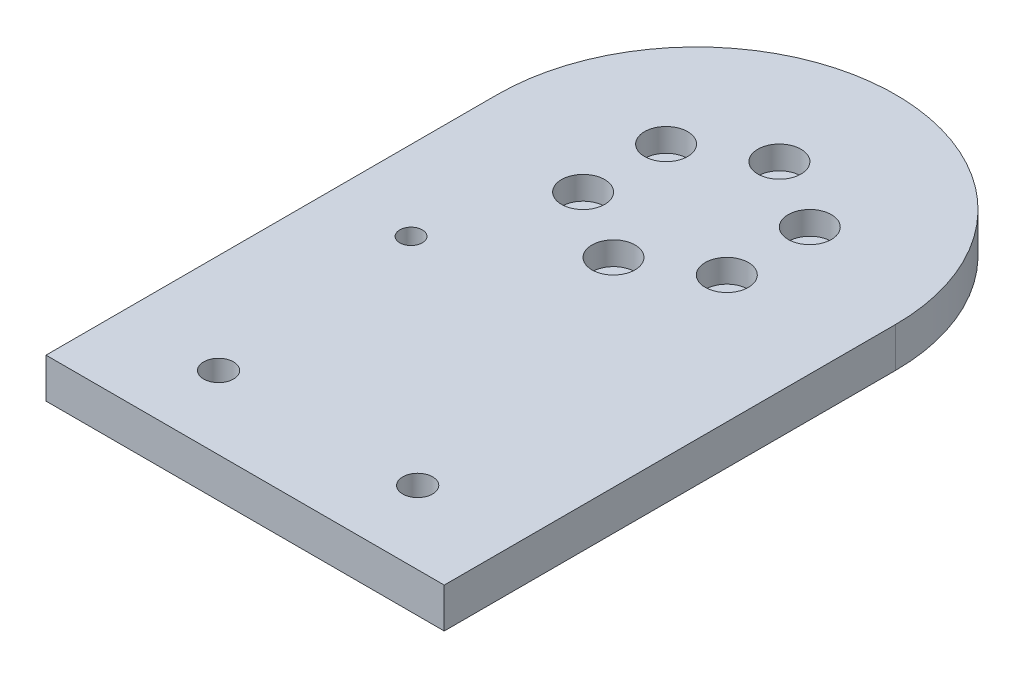
ISO-10303-21;
HEADER;
FILE_DESCRIPTION(('STEP AP214'),'2;1');
FILE_NAME('part.step','',(''),(''),'','','');
FILE_SCHEMA(('AUTOMOTIVE_DESIGN { 1 0 10303 214 1 1 1 1 }'));
ENDSEC;
DATA;
#1=APPLICATION_CONTEXT('core data for automotive mechanical design processes');
#2=APPLICATION_PROTOCOL_DEFINITION('international standard','automotive_design',2000,#1);
#3=PRODUCT_CONTEXT('',#1,'mechanical');
#4=PRODUCT('Part','Part','',(#3));
#5=PRODUCT_RELATED_PRODUCT_CATEGORY('part','',(#4));
#6=PRODUCT_DEFINITION_FORMATION('','',#4);
#7=PRODUCT_DEFINITION_CONTEXT('part definition',#1,'design');
#8=PRODUCT_DEFINITION('design','',#6,#7);
#9=PRODUCT_DEFINITION_SHAPE('','',#8);
#10=(LENGTH_UNIT() NAMED_UNIT(*) SI_UNIT(.MILLI.,.METRE.));
#11=(NAMED_UNIT(*) PLANE_ANGLE_UNIT() SI_UNIT($,.RADIAN.));
#12=(NAMED_UNIT(*) SI_UNIT($,.STERADIAN.) SOLID_ANGLE_UNIT());
#13=UNCERTAINTY_MEASURE_WITH_UNIT(LENGTH_MEASURE(1.E-05),#10,'distance_accuracy_value','');
#14=(GEOMETRIC_REPRESENTATION_CONTEXT(3) GLOBAL_UNCERTAINTY_ASSIGNED_CONTEXT((#13)) GLOBAL_UNIT_ASSIGNED_CONTEXT((#10,
#11,#12)) REPRESENTATION_CONTEXT('',''));
#15=CARTESIAN_POINT('',(0.,0.,0.));
#16=DIRECTION('',(0.,0.,1.));
#17=DIRECTION('',(1.,0.,0.));
#18=AXIS2_PLACEMENT_3D('',#15,#16,#17);
#19=CARTESIAN_POINT('',(10.8253175473055,65.75,336.25));
#20=DIRECTION('',(0.,-1.,0.));
#21=DIRECTION('',(0.,0.,-1.));
#22=AXIS2_PLACEMENT_3D('',#19,#20,#21);
#23=CYLINDRICAL_SURFACE('',#22,1.7);
#24=CARTESIAN_POINT('',(10.8253175473055,59.75,336.25));
#25=DIRECTION('',(0.,1.,0.));
#26=DIRECTION('',(0.,0.,1.));
#27=AXIS2_PLACEMENT_3D('',#24,#25,#26);
#28=CIRCLE('',#27,1.7);
#29=CARTESIAN_POINT('',(10.8253175473055,59.75,337.95));
#30=VERTEX_POINT('',#29);
#31=EDGE_CURVE('E172',#30,#30,#28,.T.);
#32=ORIENTED_EDGE('',*,*,#31,.F.);
#33=EDGE_LOOP('',(#32));
#34=FACE_BOUND('',#33,.T.);
#35=CARTESIAN_POINT('',(10.8253175473055,62.25,336.25));
#36=DIRECTION('',(0.,1.,0.));
#37=DIRECTION('',(0.,0.,1.));
#38=AXIS2_PLACEMENT_3D('',#35,#36,#37);
#39=CIRCLE('',#38,1.7);
#40=CARTESIAN_POINT('',(10.8253175473055,62.25,337.95));
#41=VERTEX_POINT('',#40);
#42=EDGE_CURVE('E50',#41,#41,#39,.T.);
#43=ORIENTED_EDGE('',*,*,#42,.T.);
#44=EDGE_LOOP('',(#43));
#45=FACE_BOUND('',#44,.T.);
#46=ADVANCED_FACE('F43',(#34,#45),#23,.F.);
#47=CARTESIAN_POINT('',(0.,65.75,342.5));
#48=DIRECTION('',(0.,-1.,0.));
#49=DIRECTION('',(0.,0.,-1.));
#50=AXIS2_PLACEMENT_3D('',#47,#48,#49);
#51=CYLINDRICAL_SURFACE('',#50,1.7);
#52=CARTESIAN_POINT('',(0.,59.75,342.5));
#53=DIRECTION('',(0.,1.,0.));
#54=DIRECTION('',(0.,0.,1.));
#55=AXIS2_PLACEMENT_3D('',#52,#53,#54);
#56=CIRCLE('',#55,1.7);
#57=CARTESIAN_POINT('',(0.,59.75,344.2));
#58=VERTEX_POINT('',#57);
#59=EDGE_CURVE('E167',#58,#58,#56,.T.);
#60=ORIENTED_EDGE('',*,*,#59,.F.);
#61=EDGE_LOOP('',(#60));
#62=FACE_BOUND('',#61,.T.);
#63=CARTESIAN_POINT('',(0.,62.25,342.5));
#64=DIRECTION('',(0.,1.,0.));
#65=DIRECTION('',(0.,0.,1.));
#66=AXIS2_PLACEMENT_3D('',#63,#64,#65);
#67=CIRCLE('',#66,1.7);
#68=CARTESIAN_POINT('',(0.,62.25,344.2));
#69=VERTEX_POINT('',#68);
#70=EDGE_CURVE('E225',#69,#69,#67,.T.);
#71=ORIENTED_EDGE('',*,*,#70,.T.);
#72=EDGE_LOOP('',(#71));
#73=FACE_BOUND('',#72,.T.);
#74=ADVANCED_FACE('F252',(#62,#73),#51,.F.);
#75=CARTESIAN_POINT('',(-10.8253175473055,65.75,336.25));
#76=DIRECTION('',(0.,-1.,0.));
#77=DIRECTION('',(0.,0.,-1.));
#78=AXIS2_PLACEMENT_3D('',#75,#76,#77);
#79=CYLINDRICAL_SURFACE('',#78,1.7);
#80=CARTESIAN_POINT('',(-10.8253175473055,59.75,336.25));
#81=DIRECTION('',(0.,1.,0.));
#82=DIRECTION('',(0.,0.,1.));
#83=AXIS2_PLACEMENT_3D('',#80,#81,#82);
#84=CIRCLE('',#83,1.7);
#85=CARTESIAN_POINT('',(-10.8253175473055,59.75,337.95));
#86=VERTEX_POINT('',#85);
#87=EDGE_CURVE('E174',#86,#86,#84,.T.);
#88=ORIENTED_EDGE('',*,*,#87,.F.);
#89=EDGE_LOOP('',(#88));
#90=FACE_BOUND('',#89,.T.);
#91=CARTESIAN_POINT('',(-10.8253175473055,62.25,336.25));
#92=DIRECTION('',(0.,1.,0.));
#93=DIRECTION('',(0.,0.,1.));
#94=AXIS2_PLACEMENT_3D('',#91,#92,#93);
#95=CIRCLE('',#94,1.7);
#96=CARTESIAN_POINT('',(-10.8253175473055,62.25,337.95));
#97=VERTEX_POINT('',#96);
#98=EDGE_CURVE('E218',#97,#97,#95,.T.);
#99=ORIENTED_EDGE('',*,*,#98,.T.);
#100=EDGE_LOOP('',(#99));
#101=FACE_BOUND('',#100,.T.);
#102=ADVANCED_FACE('F257',(#90,#101),#79,.F.);
#103=CARTESIAN_POINT('',(-10.8253175473055,65.75,323.75));
#104=DIRECTION('',(0.,-1.,0.));
#105=DIRECTION('',(0.,0.,-1.));
#106=AXIS2_PLACEMENT_3D('',#103,#104,#105);
#107=CYLINDRICAL_SURFACE('',#106,1.7);
#108=CARTESIAN_POINT('',(-10.8253175473055,59.75,323.75));
#109=DIRECTION('',(0.,1.,0.));
#110=DIRECTION('',(0.,0.,1.));
#111=AXIS2_PLACEMENT_3D('',#108,#109,#110);
#112=CIRCLE('',#111,1.7);
#113=CARTESIAN_POINT('',(-10.8253175473055,59.75,325.45));
#114=VERTEX_POINT('',#113);
#115=EDGE_CURVE('E177',#114,#114,#112,.T.);
#116=ORIENTED_EDGE('',*,*,#115,.F.);
#117=EDGE_LOOP('',(#116));
#118=FACE_BOUND('',#117,.T.);
#119=CARTESIAN_POINT('',(-10.8253175473055,62.25,323.75));
#120=DIRECTION('',(0.,1.,0.));
#121=DIRECTION('',(0.,0.,1.));
#122=AXIS2_PLACEMENT_3D('',#119,#120,#121);
#123=CIRCLE('',#122,1.7);
#124=CARTESIAN_POINT('',(-10.8253175473055,62.25,325.45));
#125=VERTEX_POINT('',#124);
#126=EDGE_CURVE('E213',#125,#125,#123,.T.);
#127=ORIENTED_EDGE('',*,*,#126,.T.);
#128=EDGE_LOOP('',(#127));
#129=FACE_BOUND('',#128,.T.);
#130=ADVANCED_FACE('F283',(#118,#129),#107,.F.);
#131=CARTESIAN_POINT('',(0.,65.75,317.5));
#132=DIRECTION('',(0.,-1.,0.));
#133=DIRECTION('',(0.,0.,-1.));
#134=AXIS2_PLACEMENT_3D('',#131,#132,#133);
#135=CYLINDRICAL_SURFACE('',#134,1.7);
#136=CARTESIAN_POINT('',(0.,59.75,317.5));
#137=DIRECTION('',(0.,1.,0.));
#138=DIRECTION('',(0.,0.,1.));
#139=AXIS2_PLACEMENT_3D('',#136,#137,#138);
#140=CIRCLE('',#139,1.7);
#141=CARTESIAN_POINT('',(0.,59.75,319.2));
#142=VERTEX_POINT('',#141);
#143=EDGE_CURVE('E182',#142,#142,#140,.T.);
#144=ORIENTED_EDGE('',*,*,#143,.F.);
#145=EDGE_LOOP('',(#144));
#146=FACE_BOUND('',#145,.T.);
#147=CARTESIAN_POINT('',(0.,62.25,317.5));
#148=DIRECTION('',(0.,1.,0.));
#149=DIRECTION('',(0.,0.,1.));
#150=AXIS2_PLACEMENT_3D('',#147,#148,#149);
#151=CIRCLE('',#150,1.7);
#152=CARTESIAN_POINT('',(0.,62.25,319.2));
#153=VERTEX_POINT('',#152);
#154=EDGE_CURVE('E212',#153,#153,#151,.T.);
#155=ORIENTED_EDGE('',*,*,#154,.T.);
#156=EDGE_LOOP('',(#155));
#157=FACE_BOUND('',#156,.T.);
#158=ADVANCED_FACE('F276',(#146,#157),#135,.F.);
#159=CARTESIAN_POINT('',(10.8253175473055,65.75,323.75));
#160=DIRECTION('',(0.,-1.,0.));
#161=DIRECTION('',(0.,0.,-1.));
#162=AXIS2_PLACEMENT_3D('',#159,#160,#161);
#163=CYLINDRICAL_SURFACE('',#162,1.7);
#164=CARTESIAN_POINT('',(10.8253175473055,59.75,323.75));
#165=DIRECTION('',(0.,1.,0.));
#166=DIRECTION('',(0.,0.,1.));
#167=AXIS2_PLACEMENT_3D('',#164,#165,#166);
#168=CIRCLE('',#167,1.7);
#169=CARTESIAN_POINT('',(10.8253175473055,59.75,325.45));
#170=VERTEX_POINT('',#169);
#171=EDGE_CURVE('E190',#170,#170,#168,.T.);
#172=ORIENTED_EDGE('',*,*,#171,.F.);
#173=EDGE_LOOP('',(#172));
#174=FACE_BOUND('',#173,.T.);
#175=CARTESIAN_POINT('',(10.8253175473055,62.25,323.75));
#176=DIRECTION('',(0.,1.,0.));
#177=DIRECTION('',(0.,0.,1.));
#178=AXIS2_PLACEMENT_3D('',#175,#176,#177);
#179=CIRCLE('',#178,1.7);
#180=CARTESIAN_POINT('',(10.8253175473055,62.25,325.45));
#181=VERTEX_POINT('',#180);
#182=EDGE_CURVE('E168',#181,#181,#179,.T.);
#183=ORIENTED_EDGE('',*,*,#182,.T.);
#184=EDGE_LOOP('',(#183));
#185=FACE_BOUND('',#184,.T.);
#186=ADVANCED_FACE('F264',(#174,#185),#163,.F.);
#187=CARTESIAN_POINT('',(30.,65.75,379.));
#188=DIRECTION('',(-1.,0.,0.));
#189=DIRECTION('',(0.,0.,1.));
#190=AXIS2_PLACEMENT_3D('',#187,#188,#189);
#191=PLANE('',#190);
#192=DIRECTION('',(0.,0.,-1.));
#193=VECTOR('',#192,1.);
#194=CARTESIAN_POINT('',(30.,59.75,379.));
#195=LINE('',#194,#193);
#196=CARTESIAN_POINT('',(30.,59.75,398.));
#197=VERTEX_POINT('',#196);
#198=CARTESIAN_POINT('',(30.,59.75,330.));
#199=VERTEX_POINT('',#198);
#200=EDGE_CURVE('E199',#197,#199,#195,.T.);
#201=ORIENTED_EDGE('',*,*,#200,.T.);
#202=DIRECTION('',(0.,-1.,0.));
#203=VECTOR('',#202,1.);
#204=CARTESIAN_POINT('',(30.,65.75,330.));
#205=LINE('',#204,#203);
#206=CARTESIAN_POINT('',(30.,65.75,330.));
#207=VERTEX_POINT('',#206);
#208=EDGE_CURVE('E11',#207,#199,#205,.T.);
#209=ORIENTED_EDGE('',*,*,#208,.F.);
#210=DIRECTION('',(0.,0.,-1.));
#211=VECTOR('',#210,1.);
#212=CARTESIAN_POINT('',(30.,65.75,379.));
#213=LINE('',#212,#211);
#214=CARTESIAN_POINT('',(30.,65.75,398.));
#215=VERTEX_POINT('',#214);
#216=EDGE_CURVE('E92',#215,#207,#213,.T.);
#217=ORIENTED_EDGE('',*,*,#216,.F.);
#218=DIRECTION('',(0.,-1.,0.));
#219=VECTOR('',#218,1.);
#220=CARTESIAN_POINT('',(30.,65.75,398.));
#221=LINE('',#220,#219);
#222=EDGE_CURVE('E106',#215,#197,#221,.T.);
#223=ORIENTED_EDGE('',*,*,#222,.T.);
#224=EDGE_LOOP('',(#201,#209,#217,#223));
#225=FACE_BOUND('',#224,.T.);
#226=ADVANCED_FACE('F44',(#225),#191,.F.);
#227=CARTESIAN_POINT('',(-30.,65.75,379.));
#228=DIRECTION('',(1.,0.,0.));
#229=DIRECTION('',(0.,0.,-1.));
#230=AXIS2_PLACEMENT_3D('',#227,#228,#229);
#231=PLANE('',#230);
#232=DIRECTION('',(0.,0.,1.));
#233=VECTOR('',#232,1.);
#234=CARTESIAN_POINT('',(-30.,59.75,379.));
#235=LINE('',#234,#233);
#236=CARTESIAN_POINT('',(-30.,59.75,330.));
#237=VERTEX_POINT('',#236);
#238=CARTESIAN_POINT('',(-30.,59.75,398.));
#239=VERTEX_POINT('',#238);
#240=EDGE_CURVE('E99',#237,#239,#235,.T.);
#241=ORIENTED_EDGE('',*,*,#240,.T.);
#242=DIRECTION('',(0.,-1.,0.));
#243=VECTOR('',#242,1.);
#244=CARTESIAN_POINT('',(-30.,65.75,398.));
#245=LINE('',#244,#243);
#246=CARTESIAN_POINT('',(-30.,65.75,398.));
#247=VERTEX_POINT('',#246);
#248=EDGE_CURVE('E97',#247,#239,#245,.T.);
#249=ORIENTED_EDGE('',*,*,#248,.F.);
#250=DIRECTION('',(0.,0.,1.));
#251=VECTOR('',#250,1.);
#252=CARTESIAN_POINT('',(-30.,65.75,379.));
#253=LINE('',#252,#251);
#254=CARTESIAN_POINT('',(-30.,65.75,330.));
#255=VERTEX_POINT('',#254);
#256=EDGE_CURVE('E81',#255,#247,#253,.T.);
#257=ORIENTED_EDGE('',*,*,#256,.F.);
#258=DIRECTION('',(0.,-1.,0.));
#259=VECTOR('',#258,1.);
#260=CARTESIAN_POINT('',(-30.,65.75,330.));
#261=LINE('',#260,#259);
#262=EDGE_CURVE('E52',#255,#237,#261,.T.);
#263=ORIENTED_EDGE('',*,*,#262,.T.);
#264=EDGE_LOOP('',(#241,#249,#257,#263));
#265=FACE_BOUND('',#264,.T.);
#266=ADVANCED_FACE('F96',(#265),#231,.F.);
#267=CARTESIAN_POINT('',(0.,65.75,0.));
#268=DIRECTION('',(0.,-1.,0.));
#269=DIRECTION('',(0.,0.,-1.));
#270=AXIS2_PLACEMENT_3D('',#267,#268,#269);
#271=PLANE('',#270);
#272=CARTESIAN_POINT('',(-18.,65.75,355.));
#273=DIRECTION('',(0.,1.,0.));
#274=DIRECTION('',(0.,0.,1.));
#275=AXIS2_PLACEMENT_3D('',#272,#273,#274);
#276=CIRCLE('',#275,1.7);
#277=CARTESIAN_POINT('',(-18.,65.75,356.7));
#278=VERTEX_POINT('',#277);
#279=EDGE_CURVE('E343',#278,#278,#276,.T.);
#280=ORIENTED_EDGE('',*,*,#279,.F.);
#281=EDGE_LOOP('',(#280));
#282=FACE_BOUND('',#281,.T.);
#283=CARTESIAN_POINT('',(-15.,65.75,387.));
#284=DIRECTION('',(0.,1.,0.));
#285=DIRECTION('',(0.,0.,1.));
#286=AXIS2_PLACEMENT_3D('',#283,#284,#285);
#287=CIRCLE('',#286,2.25);
#288=CARTESIAN_POINT('',(-15.,65.75,389.25));
#289=VERTEX_POINT('',#288);
#290=EDGE_CURVE('E120',#289,#289,#287,.T.);
#291=ORIENTED_EDGE('',*,*,#290,.F.);
#292=EDGE_LOOP('',(#291));
#293=FACE_BOUND('',#292,.T.);
#294=CARTESIAN_POINT('',(15.,65.75,387.));
#295=DIRECTION('',(0.,1.,0.));
#296=DIRECTION('',(0.,0.,1.));
#297=AXIS2_PLACEMENT_3D('',#294,#295,#296);
#298=CIRCLE('',#297,2.25);
#299=CARTESIAN_POINT('',(15.,65.75,389.25));
#300=VERTEX_POINT('',#299);
#301=EDGE_CURVE('E119',#300,#300,#298,.T.);
#302=ORIENTED_EDGE('',*,*,#301,.F.);
#303=EDGE_LOOP('',(#302));
#304=FACE_BOUND('',#303,.T.);
#305=CARTESIAN_POINT('',(10.8253175473055,65.75,323.75));
#306=DIRECTION('',(0.,1.,0.));
#307=DIRECTION('',(0.,0.,1.));
#308=AXIS2_PLACEMENT_3D('',#305,#306,#307);
#309=CIRCLE('',#308,3.25);
#310=CARTESIAN_POINT('',(10.8253175473055,65.75,327.));
#311=VERTEX_POINT('',#310);
#312=EDGE_CURVE('E102',#311,#311,#309,.T.);
#313=ORIENTED_EDGE('',*,*,#312,.F.);
#314=EDGE_LOOP('',(#313));
#315=FACE_BOUND('',#314,.T.);
#316=CARTESIAN_POINT('',(0.,65.75,317.5));
#317=DIRECTION('',(0.,1.,0.));
#318=DIRECTION('',(0.,0.,1.));
#319=AXIS2_PLACEMENT_3D('',#316,#317,#318);
#320=CIRCLE('',#319,3.25);
#321=CARTESIAN_POINT('',(0.,65.75,320.75));
#322=VERTEX_POINT('',#321);
#323=EDGE_CURVE('E154',#322,#322,#320,.T.);
#324=ORIENTED_EDGE('',*,*,#323,.F.);
#325=EDGE_LOOP('',(#324));
#326=FACE_BOUND('',#325,.T.);
#327=CARTESIAN_POINT('',(-10.8253175473055,65.75,323.75));
#328=DIRECTION('',(0.,1.,0.));
#329=DIRECTION('',(0.,0.,1.));
#330=AXIS2_PLACEMENT_3D('',#327,#328,#329);
#331=CIRCLE('',#330,3.25);
#332=CARTESIAN_POINT('',(-10.8253175473055,65.75,327.));
#333=VERTEX_POINT('',#332);
#334=EDGE_CURVE('E141',#333,#333,#331,.T.);
#335=ORIENTED_EDGE('',*,*,#334,.F.);
#336=EDGE_LOOP('',(#335));
#337=FACE_BOUND('',#336,.T.);
#338=CARTESIAN_POINT('',(-10.8253175473055,65.75,336.25));
#339=DIRECTION('',(0.,1.,0.));
#340=DIRECTION('',(0.,0.,1.));
#341=AXIS2_PLACEMENT_3D('',#338,#339,#340);
#342=CIRCLE('',#341,3.25);
#343=CARTESIAN_POINT('',(-10.8253175473055,65.75,339.5));
#344=VERTEX_POINT('',#343);
#345=EDGE_CURVE('E136',#344,#344,#342,.T.);
#346=ORIENTED_EDGE('',*,*,#345,.F.);
#347=EDGE_LOOP('',(#346));
#348=FACE_BOUND('',#347,.T.);
#349=CARTESIAN_POINT('',(0.,65.75,342.5));
#350=DIRECTION('',(0.,1.,0.));
#351=DIRECTION('',(0.,0.,1.));
#352=AXIS2_PLACEMENT_3D('',#349,#350,#351);
#353=CIRCLE('',#352,3.25);
#354=CARTESIAN_POINT('',(0.,65.75,345.75));
#355=VERTEX_POINT('',#354);
#356=EDGE_CURVE('E129',#355,#355,#353,.T.);
#357=ORIENTED_EDGE('',*,*,#356,.F.);
#358=EDGE_LOOP('',(#357));
#359=FACE_BOUND('',#358,.T.);
#360=CARTESIAN_POINT('',(10.8253175473055,65.75,336.25));
#361=DIRECTION('',(0.,1.,0.));
#362=DIRECTION('',(0.,0.,1.));
#363=AXIS2_PLACEMENT_3D('',#360,#361,#362);
#364=CIRCLE('',#363,3.25);
#365=CARTESIAN_POINT('',(10.8253175473055,65.75,339.5));
#366=VERTEX_POINT('',#365);
#367=EDGE_CURVE('E162',#366,#366,#364,.T.);
#368=ORIENTED_EDGE('',*,*,#367,.F.);
#369=EDGE_LOOP('',(#368));
#370=FACE_BOUND('',#369,.T.);
#371=ORIENTED_EDGE('',*,*,#216,.T.);
#372=CARTESIAN_POINT('',(0.,65.75,330.));
#373=DIRECTION('',(0.,1.,0.));
#374=DIRECTION('',(0.,0.,1.));
#375=AXIS2_PLACEMENT_3D('',#372,#373,#374);
#376=CIRCLE('',#375,30.);
#377=EDGE_CURVE('E91',#207,#255,#376,.T.);
#378=ORIENTED_EDGE('',*,*,#377,.T.);
#379=ORIENTED_EDGE('',*,*,#256,.T.);
#380=DIRECTION('',(1.,0.,0.));
#381=VECTOR('',#380,1.);
#382=CARTESIAN_POINT('',(-30.,65.75,398.));
#383=LINE('',#382,#381);
#384=EDGE_CURVE('E88',#247,#215,#383,.T.);
#385=ORIENTED_EDGE('',*,*,#384,.T.);
#386=EDGE_LOOP('',(#371,#378,#379,#385));
#387=FACE_BOUND('',#386,.T.);
#388=ADVANCED_FACE('F86',(#282,#293,#304,#315,#326,#337,#348,#359,#370,#387),#271,.F.);
#389=CARTESIAN_POINT('',(0.,59.75,0.));
#390=DIRECTION('',(0.,-1.,0.));
#391=DIRECTION('',(0.,0.,-1.));
#392=AXIS2_PLACEMENT_3D('',#389,#390,#391);
#393=PLANE('',#392);
#394=CARTESIAN_POINT('',(-18.,59.75,355.));
#395=DIRECTION('',(0.,1.,0.));
#396=DIRECTION('',(0.,0.,1.));
#397=AXIS2_PLACEMENT_3D('',#394,#395,#396);
#398=CIRCLE('',#397,1.7);
#399=CARTESIAN_POINT('',(-18.,59.75,356.7));
#400=VERTEX_POINT('',#399);
#401=EDGE_CURVE('E350',#400,#400,#398,.T.);
#402=ORIENTED_EDGE('',*,*,#401,.T.);
#403=EDGE_LOOP('',(#402));
#404=FACE_BOUND('',#403,.T.);
#405=CARTESIAN_POINT('',(-15.,59.75,387.));
#406=DIRECTION('',(0.,1.,0.));
#407=DIRECTION('',(0.,0.,1.));
#408=AXIS2_PLACEMENT_3D('',#405,#406,#407);
#409=CIRCLE('',#408,2.25);
#410=CARTESIAN_POINT('',(-15.,59.75,389.25));
#411=VERTEX_POINT('',#410);
#412=EDGE_CURVE('E357',#411,#411,#409,.T.);
#413=ORIENTED_EDGE('',*,*,#412,.T.);
#414=EDGE_LOOP('',(#413));
#415=FACE_BOUND('',#414,.T.);
#416=CARTESIAN_POINT('',(15.,59.75,387.));
#417=DIRECTION('',(0.,1.,0.));
#418=DIRECTION('',(0.,0.,1.));
#419=AXIS2_PLACEMENT_3D('',#416,#417,#418);
#420=CIRCLE('',#419,2.25);
#421=CARTESIAN_POINT('',(15.,59.75,389.25));
#422=VERTEX_POINT('',#421);
#423=EDGE_CURVE('E359',#422,#422,#420,.T.);
#424=ORIENTED_EDGE('',*,*,#423,.T.);
#425=EDGE_LOOP('',(#424));
#426=FACE_BOUND('',#425,.T.);
#427=ORIENTED_EDGE('',*,*,#171,.T.);
#428=EDGE_LOOP('',(#427));
#429=FACE_BOUND('',#428,.T.);
#430=ORIENTED_EDGE('',*,*,#143,.T.);
#431=EDGE_LOOP('',(#430));
#432=FACE_BOUND('',#431,.T.);
#433=ORIENTED_EDGE('',*,*,#115,.T.);
#434=EDGE_LOOP('',(#433));
#435=FACE_BOUND('',#434,.T.);
#436=ORIENTED_EDGE('',*,*,#87,.T.);
#437=EDGE_LOOP('',(#436));
#438=FACE_BOUND('',#437,.T.);
#439=ORIENTED_EDGE('',*,*,#59,.T.);
#440=EDGE_LOOP('',(#439));
#441=FACE_BOUND('',#440,.T.);
#442=ORIENTED_EDGE('',*,*,#31,.T.);
#443=EDGE_LOOP('',(#442));
#444=FACE_BOUND('',#443,.T.);
#445=ORIENTED_EDGE('',*,*,#240,.F.);
#446=CARTESIAN_POINT('',(0.,59.75,330.));
#447=DIRECTION('',(0.,1.,0.));
#448=DIRECTION('',(0.,0.,1.));
#449=AXIS2_PLACEMENT_3D('',#446,#447,#448);
#450=CIRCLE('',#449,30.);
#451=EDGE_CURVE('E58',#199,#237,#450,.T.);
#452=ORIENTED_EDGE('',*,*,#451,.F.);
#453=ORIENTED_EDGE('',*,*,#200,.F.);
#454=DIRECTION('',(1.,0.,0.));
#455=VECTOR('',#454,1.);
#456=CARTESIAN_POINT('',(-30.,59.75,398.));
#457=LINE('',#456,#455);
#458=EDGE_CURVE('E111',#239,#197,#457,.T.);
#459=ORIENTED_EDGE('',*,*,#458,.F.);
#460=EDGE_LOOP('',(#445,#452,#453,#459));
#461=FACE_BOUND('',#460,.T.);
#462=ADVANCED_FACE('F270',(#404,#415,#426,#429,#432,#435,#438,#441,#444,#461),#393,.T.);
#463=CARTESIAN_POINT('',(0.,65.75,330.));
#464=DIRECTION('',(0.,-1.,0.));
#465=DIRECTION('',(0.,0.,-1.));
#466=AXIS2_PLACEMENT_3D('',#463,#464,#465);
#467=CYLINDRICAL_SURFACE('',#466,30.);
#468=ORIENTED_EDGE('',*,*,#377,.F.);
#469=ORIENTED_EDGE('',*,*,#208,.T.);
#470=ORIENTED_EDGE('',*,*,#451,.T.);
#471=ORIENTED_EDGE('',*,*,#262,.F.);
#472=EDGE_LOOP('',(#468,#469,#470,#471));
#473=FACE_BOUND('',#472,.T.);
#474=ADVANCED_FACE('F265',(#473),#467,.T.);
#475=CARTESIAN_POINT('',(10.8253175473055,65.75,323.75));
#476=DIRECTION('',(0.,-1.,0.));
#477=DIRECTION('',(0.,0.,-1.));
#478=AXIS2_PLACEMENT_3D('',#475,#476,#477);
#479=CYLINDRICAL_SURFACE('',#478,3.25);
#480=ORIENTED_EDGE('',*,*,#312,.T.);
#481=EDGE_LOOP('',(#480));
#482=FACE_BOUND('',#481,.T.);
#483=CARTESIAN_POINT('',(10.8253175473055,62.25,323.75));
#484=DIRECTION('',(0.,1.,0.));
#485=DIRECTION('',(0.,0.,1.));
#486=AXIS2_PLACEMENT_3D('',#483,#484,#485);
#487=CIRCLE('',#486,3.25);
#488=CARTESIAN_POINT('',(10.8253175473055,62.25,327.));
#489=VERTEX_POINT('',#488);
#490=EDGE_CURVE('E152',#489,#489,#487,.T.);
#491=ORIENTED_EDGE('',*,*,#490,.F.);
#492=EDGE_LOOP('',(#491));
#493=FACE_BOUND('',#492,.T.);
#494=ADVANCED_FACE('F266',(#482,#493),#479,.F.);
#495=CARTESIAN_POINT('',(10.8253175473055,62.25,323.75));
#496=DIRECTION('',(0.,1.,0.));
#497=DIRECTION('',(0.,0.,1.));
#498=AXIS2_PLACEMENT_3D('',#495,#496,#497);
#499=PLANE('',#498);
#500=ORIENTED_EDGE('',*,*,#182,.F.);
#501=EDGE_LOOP('',(#500));
#502=FACE_BOUND('',#501,.T.);
#503=ORIENTED_EDGE('',*,*,#490,.T.);
#504=EDGE_LOOP('',(#503));
#505=FACE_BOUND('',#504,.T.);
#506=ADVANCED_FACE('F289',(#502,#505),#499,.T.);
#507=CARTESIAN_POINT('',(0.,65.75,317.5));
#508=DIRECTION('',(0.,-1.,0.));
#509=DIRECTION('',(0.,0.,-1.));
#510=AXIS2_PLACEMENT_3D('',#507,#508,#509);
#511=CYLINDRICAL_SURFACE('',#510,3.25);
#512=ORIENTED_EDGE('',*,*,#323,.T.);
#513=EDGE_LOOP('',(#512));
#514=FACE_BOUND('',#513,.T.);
#515=CARTESIAN_POINT('',(0.,62.25,317.5));
#516=DIRECTION('',(0.,1.,0.));
#517=DIRECTION('',(0.,0.,1.));
#518=AXIS2_PLACEMENT_3D('',#515,#516,#517);
#519=CIRCLE('',#518,3.25);
#520=CARTESIAN_POINT('',(0.,62.25,320.75));
#521=VERTEX_POINT('',#520);
#522=EDGE_CURVE('E150',#521,#521,#519,.T.);
#523=ORIENTED_EDGE('',*,*,#522,.F.);
#524=EDGE_LOOP('',(#523));
#525=FACE_BOUND('',#524,.T.);
#526=ADVANCED_FACE('F291',(#514,#525),#511,.F.);
#527=CARTESIAN_POINT('',(0.,62.25,317.5));
#528=DIRECTION('',(0.,1.,0.));
#529=DIRECTION('',(0.,0.,1.));
#530=AXIS2_PLACEMENT_3D('',#527,#528,#529);
#531=PLANE('',#530);
#532=ORIENTED_EDGE('',*,*,#154,.F.);
#533=EDGE_LOOP('',(#532));
#534=FACE_BOUND('',#533,.T.);
#535=ORIENTED_EDGE('',*,*,#522,.T.);
#536=EDGE_LOOP('',(#535));
#537=FACE_BOUND('',#536,.T.);
#538=ADVANCED_FACE('F305',(#534,#537),#531,.T.);
#539=CARTESIAN_POINT('',(-10.8253175473055,65.75,323.75));
#540=DIRECTION('',(0.,-1.,0.));
#541=DIRECTION('',(0.,0.,-1.));
#542=AXIS2_PLACEMENT_3D('',#539,#540,#541);
#543=CYLINDRICAL_SURFACE('',#542,3.25);
#544=ORIENTED_EDGE('',*,*,#334,.T.);
#545=EDGE_LOOP('',(#544));
#546=FACE_BOUND('',#545,.T.);
#547=CARTESIAN_POINT('',(-10.8253175473055,62.25,323.75));
#548=DIRECTION('',(0.,1.,0.));
#549=DIRECTION('',(0.,0.,1.));
#550=AXIS2_PLACEMENT_3D('',#547,#548,#549);
#551=CIRCLE('',#550,3.25);
#552=CARTESIAN_POINT('',(-10.8253175473055,62.25,327.));
#553=VERTEX_POINT('',#552);
#554=EDGE_CURVE('E139',#553,#553,#551,.T.);
#555=ORIENTED_EDGE('',*,*,#554,.F.);
#556=EDGE_LOOP('',(#555));
#557=FACE_BOUND('',#556,.T.);
#558=ADVANCED_FACE('F304',(#546,#557),#543,.F.);
#559=CARTESIAN_POINT('',(-10.8253175473055,62.25,323.75));
#560=DIRECTION('',(0.,1.,0.));
#561=DIRECTION('',(0.,0.,1.));
#562=AXIS2_PLACEMENT_3D('',#559,#560,#561);
#563=PLANE('',#562);
#564=ORIENTED_EDGE('',*,*,#126,.F.);
#565=EDGE_LOOP('',(#564));
#566=FACE_BOUND('',#565,.T.);
#567=ORIENTED_EDGE('',*,*,#554,.T.);
#568=EDGE_LOOP('',(#567));
#569=FACE_BOUND('',#568,.T.);
#570=ADVANCED_FACE('F309',(#566,#569),#563,.T.);
#571=CARTESIAN_POINT('',(-10.8253175473055,65.75,336.25));
#572=DIRECTION('',(0.,-1.,0.));
#573=DIRECTION('',(0.,0.,-1.));
#574=AXIS2_PLACEMENT_3D('',#571,#572,#573);
#575=CYLINDRICAL_SURFACE('',#574,3.25);
#576=ORIENTED_EDGE('',*,*,#345,.T.);
#577=EDGE_LOOP('',(#576));
#578=FACE_BOUND('',#577,.T.);
#579=CARTESIAN_POINT('',(-10.8253175473055,62.25,336.25));
#580=DIRECTION('',(0.,1.,0.));
#581=DIRECTION('',(0.,0.,1.));
#582=AXIS2_PLACEMENT_3D('',#579,#580,#581);
#583=CIRCLE('',#582,3.25);
#584=CARTESIAN_POINT('',(-10.8253175473055,62.25,339.5));
#585=VERTEX_POINT('',#584);
#586=EDGE_CURVE('E131',#585,#585,#583,.T.);
#587=ORIENTED_EDGE('',*,*,#586,.F.);
#588=EDGE_LOOP('',(#587));
#589=FACE_BOUND('',#588,.T.);
#590=ADVANCED_FACE('F312',(#578,#589),#575,.F.);
#591=CARTESIAN_POINT('',(-10.8253175473055,62.25,336.25));
#592=DIRECTION('',(0.,1.,0.));
#593=DIRECTION('',(0.,0.,1.));
#594=AXIS2_PLACEMENT_3D('',#591,#592,#593);
#595=PLANE('',#594);
#596=ORIENTED_EDGE('',*,*,#98,.F.);
#597=EDGE_LOOP('',(#596));
#598=FACE_BOUND('',#597,.T.);
#599=ORIENTED_EDGE('',*,*,#586,.T.);
#600=EDGE_LOOP('',(#599));
#601=FACE_BOUND('',#600,.T.);
#602=ADVANCED_FACE('F319',(#598,#601),#595,.T.);
#603=CARTESIAN_POINT('',(0.,65.75,342.5));
#604=DIRECTION('',(0.,-1.,0.));
#605=DIRECTION('',(0.,0.,-1.));
#606=AXIS2_PLACEMENT_3D('',#603,#604,#605);
#607=CYLINDRICAL_SURFACE('',#606,3.25);
#608=ORIENTED_EDGE('',*,*,#356,.T.);
#609=EDGE_LOOP('',(#608));
#610=FACE_BOUND('',#609,.T.);
#611=CARTESIAN_POINT('',(0.,62.25,342.5));
#612=DIRECTION('',(0.,1.,0.));
#613=DIRECTION('',(0.,0.,1.));
#614=AXIS2_PLACEMENT_3D('',#611,#612,#613);
#615=CIRCLE('',#614,3.25);
#616=CARTESIAN_POINT('',(0.,62.25,345.75));
#617=VERTEX_POINT('',#616);
#618=EDGE_CURVE('E124',#617,#617,#615,.T.);
#619=ORIENTED_EDGE('',*,*,#618,.F.);
#620=EDGE_LOOP('',(#619));
#621=FACE_BOUND('',#620,.T.);
#622=ADVANCED_FACE('F246',(#610,#621),#607,.F.);
#623=CARTESIAN_POINT('',(0.,62.25,342.5));
#624=DIRECTION('',(0.,1.,0.));
#625=DIRECTION('',(0.,0.,1.));
#626=AXIS2_PLACEMENT_3D('',#623,#624,#625);
#627=PLANE('',#626);
#628=ORIENTED_EDGE('',*,*,#70,.F.);
#629=EDGE_LOOP('',(#628));
#630=FACE_BOUND('',#629,.T.);
#631=ORIENTED_EDGE('',*,*,#618,.T.);
#632=EDGE_LOOP('',(#631));
#633=FACE_BOUND('',#632,.T.);
#634=ADVANCED_FACE('F241',(#630,#633),#627,.T.);
#635=CARTESIAN_POINT('',(10.8253175473055,65.75,336.25));
#636=DIRECTION('',(0.,-1.,0.));
#637=DIRECTION('',(0.,0.,-1.));
#638=AXIS2_PLACEMENT_3D('',#635,#636,#637);
#639=CYLINDRICAL_SURFACE('',#638,3.25);
#640=ORIENTED_EDGE('',*,*,#367,.T.);
#641=EDGE_LOOP('',(#640));
#642=FACE_BOUND('',#641,.T.);
#643=CARTESIAN_POINT('',(10.8253175473055,62.25,336.25));
#644=DIRECTION('',(0.,1.,0.));
#645=DIRECTION('',(0.,0.,1.));
#646=AXIS2_PLACEMENT_3D('',#643,#644,#645);
#647=CIRCLE('',#646,3.25);
#648=CARTESIAN_POINT('',(10.8253175473055,62.25,339.5));
#649=VERTEX_POINT('',#648);
#650=EDGE_CURVE('E130',#649,#649,#647,.T.);
#651=ORIENTED_EDGE('',*,*,#650,.F.);
#652=EDGE_LOOP('',(#651));
#653=FACE_BOUND('',#652,.T.);
#654=ADVANCED_FACE('F236',(#642,#653),#639,.F.);
#655=CARTESIAN_POINT('',(10.8253175473055,62.25,336.25));
#656=DIRECTION('',(0.,1.,0.));
#657=DIRECTION('',(0.,0.,1.));
#658=AXIS2_PLACEMENT_3D('',#655,#656,#657);
#659=PLANE('',#658);
#660=ORIENTED_EDGE('',*,*,#42,.F.);
#661=EDGE_LOOP('',(#660));
#662=FACE_BOUND('',#661,.T.);
#663=ORIENTED_EDGE('',*,*,#650,.T.);
#664=EDGE_LOOP('',(#663));
#665=FACE_BOUND('',#664,.T.);
#666=ADVANCED_FACE('F231',(#662,#665),#659,.T.);
#667=CARTESIAN_POINT('',(-30.,65.75,398.));
#668=DIRECTION('',(0.,0.,-1.));
#669=DIRECTION('',(-1.,0.,0.));
#670=AXIS2_PLACEMENT_3D('',#667,#668,#669);
#671=PLANE('',#670);
#672=ORIENTED_EDGE('',*,*,#458,.T.);
#673=ORIENTED_EDGE('',*,*,#222,.F.);
#674=ORIENTED_EDGE('',*,*,#384,.F.);
#675=ORIENTED_EDGE('',*,*,#248,.T.);
#676=EDGE_LOOP('',(#672,#673,#674,#675));
#677=FACE_BOUND('',#676,.T.);
#678=ADVANCED_FACE('F108',(#677),#671,.F.);
#679=CARTESIAN_POINT('',(15.,65.75,387.));
#680=DIRECTION('',(0.,-1.,0.));
#681=DIRECTION('',(0.,0.,-1.));
#682=AXIS2_PLACEMENT_3D('',#679,#680,#681);
#683=CYLINDRICAL_SURFACE('',#682,2.25);
#684=ORIENTED_EDGE('',*,*,#301,.T.);
#685=EDGE_LOOP('',(#684));
#686=FACE_BOUND('',#685,.T.);
#687=ORIENTED_EDGE('',*,*,#423,.F.);
#688=EDGE_LOOP('',(#687));
#689=FACE_BOUND('',#688,.T.);
#690=ADVANCED_FACE('F327',(#686,#689),#683,.F.);
#691=CARTESIAN_POINT('',(-15.,65.75,387.));
#692=DIRECTION('',(0.,-1.,0.));
#693=DIRECTION('',(0.,0.,-1.));
#694=AXIS2_PLACEMENT_3D('',#691,#692,#693);
#695=CYLINDRICAL_SURFACE('',#694,2.25);
#696=ORIENTED_EDGE('',*,*,#290,.T.);
#697=EDGE_LOOP('',(#696));
#698=FACE_BOUND('',#697,.T.);
#699=ORIENTED_EDGE('',*,*,#412,.F.);
#700=EDGE_LOOP('',(#699));
#701=FACE_BOUND('',#700,.T.);
#702=ADVANCED_FACE('F333',(#698,#701),#695,.F.);
#703=CARTESIAN_POINT('',(-18.,65.75,355.));
#704=DIRECTION('',(0.,-1.,0.));
#705=DIRECTION('',(0.,0.,-1.));
#706=AXIS2_PLACEMENT_3D('',#703,#704,#705);
#707=CYLINDRICAL_SURFACE('',#706,1.7);
#708=ORIENTED_EDGE('',*,*,#279,.T.);
#709=EDGE_LOOP('',(#708));
#710=FACE_BOUND('',#709,.T.);
#711=ORIENTED_EDGE('',*,*,#401,.F.);
#712=EDGE_LOOP('',(#711));
#713=FACE_BOUND('',#712,.T.);
#714=ADVANCED_FACE('F340',(#710,#713),#707,.F.);
#715=CLOSED_SHELL('',(#46,#74,#102,#130,#158,#186,#226,#266,#388,#462,#474,#494,#506,#526,#538,
#558,#570,#590,#602,#622,#634,#654,#666,#678,#690,#702,#714));
#716=MANIFOLD_SOLID_BREP('B2',#715);
#717=ADVANCED_BREP_SHAPE_REPRESENTATION('',(#18,#716),#14);
#718=SHAPE_DEFINITION_REPRESENTATION(#9,#717);
ENDSEC;
END-ISO-10303-21;
